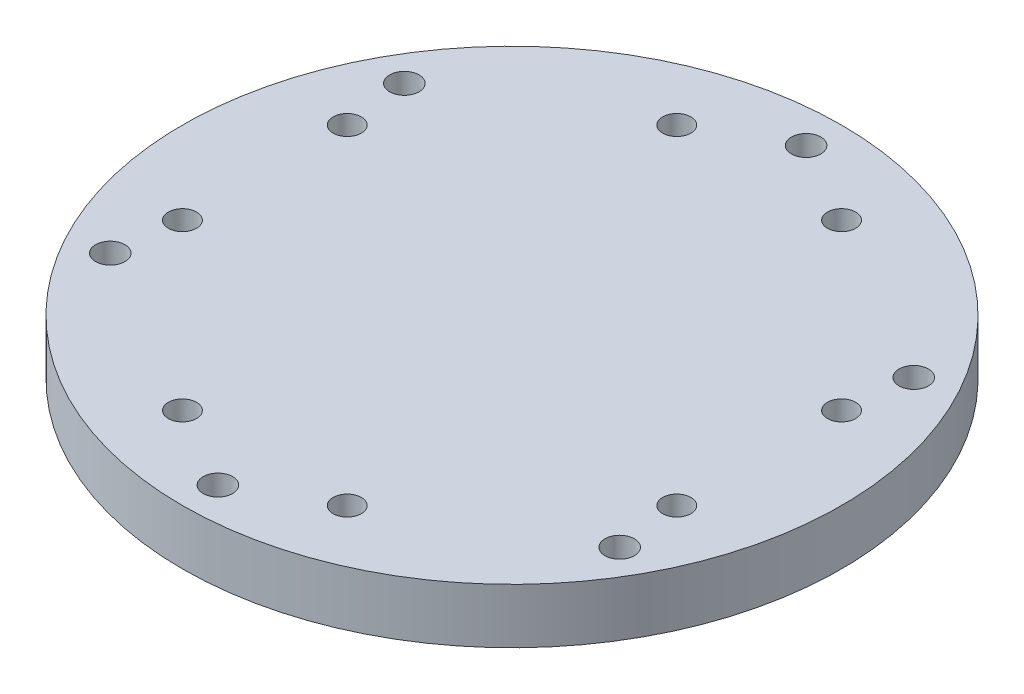
ISO-10303-21;
HEADER;
FILE_DESCRIPTION(('STEP AP214'),'2;1');
FILE_NAME('part.step','',(''),(''),'','','');
FILE_SCHEMA(('AUTOMOTIVE_DESIGN { 1 0 10303 214 1 1 1 1 }'));
ENDSEC;
DATA;
#1=APPLICATION_CONTEXT('core data for automotive mechanical design processes');
#2=APPLICATION_PROTOCOL_DEFINITION('international standard','automotive_design',2000,#1);
#3=PRODUCT_CONTEXT('',#1,'mechanical');
#4=PRODUCT('Part','Part','',(#3));
#5=PRODUCT_RELATED_PRODUCT_CATEGORY('part','',(#4));
#6=PRODUCT_DEFINITION_FORMATION('','',#4);
#7=PRODUCT_DEFINITION_CONTEXT('part definition',#1,'design');
#8=PRODUCT_DEFINITION('design','',#6,#7);
#9=PRODUCT_DEFINITION_SHAPE('','',#8);
#10=(LENGTH_UNIT() NAMED_UNIT(*) SI_UNIT(.MILLI.,.METRE.));
#11=(NAMED_UNIT(*) PLANE_ANGLE_UNIT() SI_UNIT($,.RADIAN.));
#12=(NAMED_UNIT(*) SI_UNIT($,.STERADIAN.) SOLID_ANGLE_UNIT());
#13=UNCERTAINTY_MEASURE_WITH_UNIT(LENGTH_MEASURE(1.E-05),#10,'distance_accuracy_value','');
#14=(GEOMETRIC_REPRESENTATION_CONTEXT(3) GLOBAL_UNCERTAINTY_ASSIGNED_CONTEXT((#13)) GLOBAL_UNIT_ASSIGNED_CONTEXT((#10,
#11,#12)) REPRESENTATION_CONTEXT('',''));
#15=CARTESIAN_POINT('',(0.,0.,0.));
#16=DIRECTION('',(0.,0.,1.));
#17=DIRECTION('',(1.,0.,0.));
#18=AXIS2_PLACEMENT_3D('',#15,#16,#17);
#19=CARTESIAN_POINT('',(0.,0.,0.));
#20=DIRECTION('',(0.,1.,0.));
#21=DIRECTION('',(0.,0.,1.));
#22=AXIS2_PLACEMENT_3D('',#19,#20,#21);
#23=PLANE('',#22);
#24=CARTESIAN_POINT('',(-57.1499999999973,0.,19.0499999994328));
#25=DIRECTION('',(0.,-1.,0.));
#26=DIRECTION('',(0.,0.,-1.));
#27=AXIS2_PLACEMENT_3D('',#24,#25,#26);
#28=CIRCLE('',#27,3.2639);
#29=CARTESIAN_POINT('',(-57.1499999999973,0.,15.7860999994328));
#30=VERTEX_POINT('',#29);
#31=EDGE_CURVE('E126',#30,#30,#28,.T.);
#32=ORIENTED_EDGE('',*,*,#31,.F.);
#33=EDGE_LOOP('',(#32));
#34=FACE_BOUND('',#33,.T.);
#35=CARTESIAN_POINT('',(19.0499999994334,0.,57.1499999999971));
#36=DIRECTION('',(0.,-1.,0.));
#37=DIRECTION('',(0.,0.,-1.));
#38=AXIS2_PLACEMENT_3D('',#35,#36,#37);
#39=CIRCLE('',#38,3.2639);
#40=CARTESIAN_POINT('',(19.0499999994334,0.,53.8860999999971));
#41=VERTEX_POINT('',#40);
#42=EDGE_CURVE('E114',#41,#41,#39,.T.);
#43=ORIENTED_EDGE('',*,*,#42,.F.);
#44=EDGE_LOOP('',(#43));
#45=FACE_BOUND('',#44,.T.);
#46=CARTESIAN_POINT('',(57.1499999999972,0.,-19.0499999994332));
#47=DIRECTION('',(0.,-1.,0.));
#48=DIRECTION('',(0.,0.,-1.));
#49=AXIS2_PLACEMENT_3D('',#46,#47,#48);
#50=CIRCLE('',#49,3.2639);
#51=CARTESIAN_POINT('',(57.1499999999972,0.,-22.3138999994332));
#52=VERTEX_POINT('',#51);
#53=EDGE_CURVE('E102',#52,#52,#50,.T.);
#54=ORIENTED_EDGE('',*,*,#53,.F.);
#55=EDGE_LOOP('',(#54));
#56=FACE_BOUND('',#55,.T.);
#57=CARTESIAN_POINT('',(19.0499999994334,0.,-57.1499999999971));
#58=DIRECTION('',(0.,-1.,0.));
#59=DIRECTION('',(0.,0.,-1.));
#60=AXIS2_PLACEMENT_3D('',#57,#58,#59);
#61=CIRCLE('',#60,3.2639);
#62=CARTESIAN_POINT('',(19.0499999994334,0.,-60.4138999999971));
#63=VERTEX_POINT('',#62);
#64=EDGE_CURVE('E96',#63,#63,#61,.T.);
#65=ORIENTED_EDGE('',*,*,#64,.F.);
#66=EDGE_LOOP('',(#65));
#67=FACE_BOUND('',#66,.T.);
#68=CARTESIAN_POINT('',(-19.0499999994334,0.,-57.1499999999971));
#69=DIRECTION('',(0.,-1.,0.));
#70=DIRECTION('',(0.,0.,-1.));
#71=AXIS2_PLACEMENT_3D('',#68,#69,#70);
#72=CIRCLE('',#71,3.2639);
#73=CARTESIAN_POINT('',(-19.0499999994334,0.,-60.4138999999971));
#74=VERTEX_POINT('',#73);
#75=EDGE_CURVE('E90',#74,#74,#72,.T.);
#76=ORIENTED_EDGE('',*,*,#75,.F.);
#77=EDGE_LOOP('',(#76));
#78=FACE_BOUND('',#77,.T.);
#79=CARTESIAN_POINT('',(-58.8897274573414,0.,-34.0000000000007));
#80=DIRECTION('',(0.,1.,0.));
#81=DIRECTION('',(0.866025403784433,0.,0.50000000000001));
#82=AXIS2_PLACEMENT_3D('',#79,#80,#81);
#83=CIRCLE('',#82,3.4);
#84=CARTESIAN_POINT('',(-55.9452410844744,0.,-32.3000000000007));
#85=VERTEX_POINT('',#84);
#86=EDGE_CURVE('E68',#85,#85,#83,.T.);
#87=ORIENTED_EDGE('',*,*,#86,.T.);
#88=EDGE_LOOP('',(#87));
#89=FACE_BOUND('',#88,.T.);
#90=CARTESIAN_POINT('',(-58.8897274573421,0.,33.9999999999995));
#91=DIRECTION('',(0.,1.,0.));
#92=DIRECTION('',(0.866025403784443,0.,-0.499999999999992));
#93=AXIS2_PLACEMENT_3D('',#90,#91,#92);
#94=CIRCLE('',#93,3.4);
#95=CARTESIAN_POINT('',(-55.945241084475,0.,32.2999999999995));
#96=VERTEX_POINT('',#95);
#97=EDGE_CURVE('E67',#96,#96,#94,.T.);
#98=ORIENTED_EDGE('',*,*,#97,.T.);
#99=EDGE_LOOP('',(#98));
#100=FACE_BOUND('',#99,.T.);
#101=CARTESIAN_POINT('',(0.,0.,68.));
#102=DIRECTION('',(0.,1.,0.));
#103=DIRECTION('',(0.,0.,-1.));
#104=AXIS2_PLACEMENT_3D('',#101,#102,#103);
#105=CIRCLE('',#104,3.4);
#106=CARTESIAN_POINT('',(0.,0.,64.6));
#107=VERTEX_POINT('',#106);
#108=EDGE_CURVE('E75',#107,#107,#105,.T.);
#109=ORIENTED_EDGE('',*,*,#108,.T.);
#110=EDGE_LOOP('',(#109));
#111=FACE_BOUND('',#110,.T.);
#112=CARTESIAN_POINT('',(58.8897274573417,0.,34.0000000000003));
#113=DIRECTION('',(0.,1.,0.));
#114=DIRECTION('',(-0.866025403784436,0.,-0.500000000000004));
#115=AXIS2_PLACEMENT_3D('',#112,#113,#114);
#116=CIRCLE('',#115,3.4);
#117=CARTESIAN_POINT('',(55.9452410844746,0.,32.3000000000003));
#118=VERTEX_POINT('',#117);
#119=EDGE_CURVE('E81',#118,#118,#116,.T.);
#120=ORIENTED_EDGE('',*,*,#119,.T.);
#121=EDGE_LOOP('',(#120));
#122=FACE_BOUND('',#121,.T.);
#123=CARTESIAN_POINT('',(58.8897274573419,0.,-33.9999999999999));
#124=DIRECTION('',(0.,1.,0.));
#125=DIRECTION('',(-0.86602540378444,0.,0.499999999999998));
#126=AXIS2_PLACEMENT_3D('',#123,#124,#125);
#127=CIRCLE('',#126,3.4);
#128=CARTESIAN_POINT('',(55.9452410844748,0.,-32.2999999999999));
#129=VERTEX_POINT('',#128);
#130=EDGE_CURVE('E60',#129,#129,#127,.T.);
#131=ORIENTED_EDGE('',*,*,#130,.T.);
#132=EDGE_LOOP('',(#131));
#133=FACE_BOUND('',#132,.T.);
#134=CARTESIAN_POINT('',(0.,0.,-68.));
#135=DIRECTION('',(0.,1.,0.));
#136=DIRECTION('',(0.,0.,1.));
#137=AXIS2_PLACEMENT_3D('',#134,#135,#136);
#138=CIRCLE('',#137,3.4);
#139=CARTESIAN_POINT('',(0.,0.,-64.6));
#140=VERTEX_POINT('',#139);
#141=EDGE_CURVE('E50',#140,#140,#138,.T.);
#142=ORIENTED_EDGE('',*,*,#141,.T.);
#143=EDGE_LOOP('',(#142));
#144=FACE_BOUND('',#143,.T.);
#145=CARTESIAN_POINT('',(0.,0.,0.));
#146=DIRECTION('',(0.,1.,0.));
#147=DIRECTION('',(0.,0.,1.));
#148=AXIS2_PLACEMENT_3D('',#145,#146,#147);
#149=CIRCLE('',#148,76.2);
#150=CARTESIAN_POINT('',(0.,0.,76.2));
#151=VERTEX_POINT('',#150);
#152=EDGE_CURVE('E43',#151,#151,#149,.T.);
#153=ORIENTED_EDGE('',*,*,#152,.F.);
#154=EDGE_LOOP('',(#153));
#155=FACE_BOUND('',#154,.T.);
#156=CARTESIAN_POINT('',(57.1499999999971,0.,19.0499999994336));
#157=DIRECTION('',(0.,-1.,0.));
#158=DIRECTION('',(0.,0.,-1.));
#159=AXIS2_PLACEMENT_3D('',#156,#157,#158);
#160=CIRCLE('',#159,3.2639);
#161=CARTESIAN_POINT('',(57.1499999999971,0.,15.7860999994336));
#162=VERTEX_POINT('',#161);
#163=EDGE_CURVE('E108',#162,#162,#160,.T.);
#164=ORIENTED_EDGE('',*,*,#163,.F.);
#165=EDGE_LOOP('',(#164));
#166=FACE_BOUND('',#165,.T.);
#167=CARTESIAN_POINT('',(-19.0499999994334,0.,57.1499999999971));
#168=DIRECTION('',(0.,-1.,0.));
#169=DIRECTION('',(0.,0.,-1.));
#170=AXIS2_PLACEMENT_3D('',#167,#168,#169);
#171=CIRCLE('',#170,3.2639);
#172=CARTESIAN_POINT('',(-19.0499999994334,0.,53.8860999999971));
#173=VERTEX_POINT('',#172);
#174=EDGE_CURVE('E120',#173,#173,#171,.T.);
#175=ORIENTED_EDGE('',*,*,#174,.F.);
#176=EDGE_LOOP('',(#175));
#177=FACE_BOUND('',#176,.T.);
#178=CARTESIAN_POINT('',(-57.1499999999969,0.,-19.049999999434));
#179=DIRECTION('',(0.,-1.,0.));
#180=DIRECTION('',(0.,0.,-1.));
#181=AXIS2_PLACEMENT_3D('',#178,#179,#180);
#182=CIRCLE('',#181,3.2639);
#183=CARTESIAN_POINT('',(-57.1499999999969,0.,-22.313899999434));
#184=VERTEX_POINT('',#183);
#185=EDGE_CURVE('E132',#184,#184,#182,.T.);
#186=ORIENTED_EDGE('',*,*,#185,.F.);
#187=EDGE_LOOP('',(#186));
#188=FACE_BOUND('',#187,.T.);
#189=ADVANCED_FACE('F39',(#34,#45,#56,#67,#78,#89,#100,#111,#122,#133,#144,#155,#166,#177,#188),
#23,.F.);
#190=CARTESIAN_POINT('',(0.,12.7,0.));
#191=DIRECTION('',(0.,1.,0.));
#192=DIRECTION('',(0.,0.,1.));
#193=AXIS2_PLACEMENT_3D('',#190,#191,#192);
#194=PLANE('',#193);
#195=CARTESIAN_POINT('',(-57.1499999999969,12.7,-19.049999999434));
#196=DIRECTION('',(0.,-1.,0.));
#197=DIRECTION('',(0.,0.,-1.));
#198=AXIS2_PLACEMENT_3D('',#195,#196,#197);
#199=CIRCLE('',#198,3.2639);
#200=CARTESIAN_POINT('',(-57.1499999999969,12.7,-22.313899999434));
#201=VERTEX_POINT('',#200);
#202=EDGE_CURVE('E129',#201,#201,#199,.T.);
#203=ORIENTED_EDGE('',*,*,#202,.T.);
#204=EDGE_LOOP('',(#203));
#205=FACE_BOUND('',#204,.T.);
#206=CARTESIAN_POINT('',(-19.0499999994334,12.7,57.1499999999971));
#207=DIRECTION('',(0.,-1.,0.));
#208=DIRECTION('',(0.,0.,-1.));
#209=AXIS2_PLACEMENT_3D('',#206,#207,#208);
#210=CIRCLE('',#209,3.2639);
#211=CARTESIAN_POINT('',(-19.0499999994334,12.7,53.8860999999971));
#212=VERTEX_POINT('',#211);
#213=EDGE_CURVE('E117',#212,#212,#210,.T.);
#214=ORIENTED_EDGE('',*,*,#213,.T.);
#215=EDGE_LOOP('',(#214));
#216=FACE_BOUND('',#215,.T.);
#217=CARTESIAN_POINT('',(19.0499999994334,12.7,57.1499999999971));
#218=DIRECTION('',(0.,-1.,0.));
#219=DIRECTION('',(0.,0.,-1.));
#220=AXIS2_PLACEMENT_3D('',#217,#218,#219);
#221=CIRCLE('',#220,3.2639);
#222=CARTESIAN_POINT('',(19.0499999994334,12.7,53.8860999999971));
#223=VERTEX_POINT('',#222);
#224=EDGE_CURVE('E111',#223,#223,#221,.T.);
#225=ORIENTED_EDGE('',*,*,#224,.T.);
#226=EDGE_LOOP('',(#225));
#227=FACE_BOUND('',#226,.T.);
#228=CARTESIAN_POINT('',(57.1499999999971,12.7,19.0499999994336));
#229=DIRECTION('',(0.,-1.,0.));
#230=DIRECTION('',(0.,0.,-1.));
#231=AXIS2_PLACEMENT_3D('',#228,#229,#230);
#232=CIRCLE('',#231,3.2639);
#233=CARTESIAN_POINT('',(57.1499999999971,12.7,15.7860999994336));
#234=VERTEX_POINT('',#233);
#235=EDGE_CURVE('E105',#234,#234,#232,.T.);
#236=ORIENTED_EDGE('',*,*,#235,.T.);
#237=EDGE_LOOP('',(#236));
#238=FACE_BOUND('',#237,.T.);
#239=CARTESIAN_POINT('',(0.,12.7,0.));
#240=DIRECTION('',(0.,1.,0.));
#241=DIRECTION('',(0.,0.,1.));
#242=AXIS2_PLACEMENT_3D('',#239,#240,#241);
#243=CIRCLE('',#242,76.2);
#244=CARTESIAN_POINT('',(0.,12.7,76.2));
#245=VERTEX_POINT('',#244);
#246=EDGE_CURVE('E10',#245,#245,#243,.T.);
#247=ORIENTED_EDGE('',*,*,#246,.T.);
#248=EDGE_LOOP('',(#247));
#249=FACE_BOUND('',#248,.T.);
#250=CARTESIAN_POINT('',(0.,12.7,-68.));
#251=DIRECTION('',(0.,1.,0.));
#252=DIRECTION('',(0.,0.,1.));
#253=AXIS2_PLACEMENT_3D('',#250,#251,#252);
#254=CIRCLE('',#253,3.4);
#255=CARTESIAN_POINT('',(0.,12.7,-64.6));
#256=VERTEX_POINT('',#255);
#257=EDGE_CURVE('E54',#256,#256,#254,.T.);
#258=ORIENTED_EDGE('',*,*,#257,.F.);
#259=EDGE_LOOP('',(#258));
#260=FACE_BOUND('',#259,.T.);
#261=CARTESIAN_POINT('',(58.8897274573419,12.7,-33.9999999999999));
#262=DIRECTION('',(0.,1.,0.));
#263=DIRECTION('',(-0.86602540378444,0.,0.499999999999998));
#264=AXIS2_PLACEMENT_3D('',#261,#262,#263);
#265=CIRCLE('',#264,3.4);
#266=CARTESIAN_POINT('',(55.9452410844748,12.7,-32.2999999999999));
#267=VERTEX_POINT('',#266);
#268=EDGE_CURVE('E57',#267,#267,#265,.T.);
#269=ORIENTED_EDGE('',*,*,#268,.F.);
#270=EDGE_LOOP('',(#269));
#271=FACE_BOUND('',#270,.T.);
#272=CARTESIAN_POINT('',(58.8897274573417,12.7,34.0000000000003));
#273=DIRECTION('',(0.,1.,0.));
#274=DIRECTION('',(-0.866025403784436,0.,-0.500000000000004));
#275=AXIS2_PLACEMENT_3D('',#272,#273,#274);
#276=CIRCLE('',#275,3.4);
#277=CARTESIAN_POINT('',(55.9452410844746,12.7,32.3000000000003));
#278=VERTEX_POINT('',#277);
#279=EDGE_CURVE('E63',#278,#278,#276,.T.);
#280=ORIENTED_EDGE('',*,*,#279,.F.);
#281=EDGE_LOOP('',(#280));
#282=FACE_BOUND('',#281,.T.);
#283=CARTESIAN_POINT('',(0.,12.7,68.));
#284=DIRECTION('',(0.,1.,0.));
#285=DIRECTION('',(0.,0.,-1.));
#286=AXIS2_PLACEMENT_3D('',#283,#284,#285);
#287=CIRCLE('',#286,3.4);
#288=CARTESIAN_POINT('',(0.,12.7,64.6));
#289=VERTEX_POINT('',#288);
#290=EDGE_CURVE('E78',#289,#289,#287,.T.);
#291=ORIENTED_EDGE('',*,*,#290,.F.);
#292=EDGE_LOOP('',(#291));
#293=FACE_BOUND('',#292,.T.);
#294=CARTESIAN_POINT('',(-58.8897274573421,12.7,33.9999999999995));
#295=DIRECTION('',(0.,1.,0.));
#296=DIRECTION('',(0.866025403784443,0.,-0.499999999999992));
#297=AXIS2_PLACEMENT_3D('',#294,#295,#296);
#298=CIRCLE('',#297,3.4);
#299=CARTESIAN_POINT('',(-55.945241084475,12.7,32.2999999999995));
#300=VERTEX_POINT('',#299);
#301=EDGE_CURVE('E72',#300,#300,#298,.T.);
#302=ORIENTED_EDGE('',*,*,#301,.F.);
#303=EDGE_LOOP('',(#302));
#304=FACE_BOUND('',#303,.T.);
#305=CARTESIAN_POINT('',(-58.8897274573414,12.7,-34.0000000000007));
#306=DIRECTION('',(0.,1.,0.));
#307=DIRECTION('',(0.866025403784433,0.,0.50000000000001));
#308=AXIS2_PLACEMENT_3D('',#305,#306,#307);
#309=CIRCLE('',#308,3.4);
#310=CARTESIAN_POINT('',(-55.9452410844744,12.7,-32.3000000000007));
#311=VERTEX_POINT('',#310);
#312=EDGE_CURVE('E64',#311,#311,#309,.T.);
#313=ORIENTED_EDGE('',*,*,#312,.F.);
#314=EDGE_LOOP('',(#313));
#315=FACE_BOUND('',#314,.T.);
#316=CARTESIAN_POINT('',(-19.0499999994334,12.7,-57.1499999999971));
#317=DIRECTION('',(0.,-1.,0.));
#318=DIRECTION('',(0.,0.,-1.));
#319=AXIS2_PLACEMENT_3D('',#316,#317,#318);
#320=CIRCLE('',#319,3.2639);
#321=CARTESIAN_POINT('',(-19.0499999994334,12.7,-60.4138999999971));
#322=VERTEX_POINT('',#321);
#323=EDGE_CURVE('E71',#322,#322,#320,.T.);
#324=ORIENTED_EDGE('',*,*,#323,.T.);
#325=EDGE_LOOP('',(#324));
#326=FACE_BOUND('',#325,.T.);
#327=CARTESIAN_POINT('',(19.0499999994334,12.7,-57.1499999999971));
#328=DIRECTION('',(0.,-1.,0.));
#329=DIRECTION('',(0.,0.,-1.));
#330=AXIS2_PLACEMENT_3D('',#327,#328,#329);
#331=CIRCLE('',#330,3.2639);
#332=CARTESIAN_POINT('',(19.0499999994334,12.7,-60.4138999999971));
#333=VERTEX_POINT('',#332);
#334=EDGE_CURVE('E93',#333,#333,#331,.T.);
#335=ORIENTED_EDGE('',*,*,#334,.T.);
#336=EDGE_LOOP('',(#335));
#337=FACE_BOUND('',#336,.T.);
#338=CARTESIAN_POINT('',(57.1499999999972,12.7,-19.0499999994332));
#339=DIRECTION('',(0.,-1.,0.));
#340=DIRECTION('',(0.,0.,-1.));
#341=AXIS2_PLACEMENT_3D('',#338,#339,#340);
#342=CIRCLE('',#341,3.2639);
#343=CARTESIAN_POINT('',(57.1499999999972,12.7,-22.3138999994332));
#344=VERTEX_POINT('',#343);
#345=EDGE_CURVE('E99',#344,#344,#342,.T.);
#346=ORIENTED_EDGE('',*,*,#345,.T.);
#347=EDGE_LOOP('',(#346));
#348=FACE_BOUND('',#347,.T.);
#349=CARTESIAN_POINT('',(-57.1499999999973,12.7,19.0499999994328));
#350=DIRECTION('',(0.,-1.,0.));
#351=DIRECTION('',(0.,0.,-1.));
#352=AXIS2_PLACEMENT_3D('',#349,#350,#351);
#353=CIRCLE('',#352,3.2639);
#354=CARTESIAN_POINT('',(-57.1499999999973,12.7,15.7860999994328));
#355=VERTEX_POINT('',#354);
#356=EDGE_CURVE('E123',#355,#355,#353,.T.);
#357=ORIENTED_EDGE('',*,*,#356,.T.);
#358=EDGE_LOOP('',(#357));
#359=FACE_BOUND('',#358,.T.);
#360=ADVANCED_FACE('F139',(#205,#216,#227,#238,#249,#260,#271,#282,#293,#304,#315,#326,#337,
#348,#359),#194,.T.);
#361=CARTESIAN_POINT('',(0.,12.7,0.));
#362=DIRECTION('',(0.,-1.,0.));
#363=DIRECTION('',(0.,0.,-1.));
#364=AXIS2_PLACEMENT_3D('',#361,#362,#363);
#365=CYLINDRICAL_SURFACE('',#364,76.2);
#366=ORIENTED_EDGE('',*,*,#246,.F.);
#367=EDGE_LOOP('',(#366));
#368=FACE_BOUND('',#367,.T.);
#369=ORIENTED_EDGE('',*,*,#152,.T.);
#370=EDGE_LOOP('',(#369));
#371=FACE_BOUND('',#370,.T.);
#372=ADVANCED_FACE('F41',(#368,#371),#365,.T.);
#373=CARTESIAN_POINT('',(0.,12.7,-68.));
#374=DIRECTION('',(0.,1.,0.));
#375=DIRECTION('',(0.,0.,1.));
#376=AXIS2_PLACEMENT_3D('',#373,#374,#375);
#377=CYLINDRICAL_SURFACE('',#376,3.4);
#378=ORIENTED_EDGE('',*,*,#141,.F.);
#379=EDGE_LOOP('',(#378));
#380=FACE_BOUND('',#379,.T.);
#381=ORIENTED_EDGE('',*,*,#257,.T.);
#382=EDGE_LOOP('',(#381));
#383=FACE_BOUND('',#382,.T.);
#384=ADVANCED_FACE('F149',(#380,#383),#377,.F.);
#385=CARTESIAN_POINT('',(58.8897274573419,12.7,-33.9999999999999));
#386=DIRECTION('',(0.,1.,0.));
#387=DIRECTION('',(-0.86602540378444,0.,0.499999999999998));
#388=AXIS2_PLACEMENT_3D('',#385,#386,#387);
#389=CYLINDRICAL_SURFACE('',#388,3.4);
#390=ORIENTED_EDGE('',*,*,#130,.F.);
#391=EDGE_LOOP('',(#390));
#392=FACE_BOUND('',#391,.T.);
#393=ORIENTED_EDGE('',*,*,#268,.T.);
#394=EDGE_LOOP('',(#393));
#395=FACE_BOUND('',#394,.T.);
#396=ADVANCED_FACE('F152',(#392,#395),#389,.F.);
#397=CARTESIAN_POINT('',(58.8897274573417,12.7,34.0000000000003));
#398=DIRECTION('',(0.,1.,0.));
#399=DIRECTION('',(-0.866025403784436,0.,-0.500000000000004));
#400=AXIS2_PLACEMENT_3D('',#397,#398,#399);
#401=CYLINDRICAL_SURFACE('',#400,3.4);
#402=ORIENTED_EDGE('',*,*,#119,.F.);
#403=EDGE_LOOP('',(#402));
#404=FACE_BOUND('',#403,.T.);
#405=ORIENTED_EDGE('',*,*,#279,.T.);
#406=EDGE_LOOP('',(#405));
#407=FACE_BOUND('',#406,.T.);
#408=ADVANCED_FACE('F156',(#404,#407),#401,.F.);
#409=CARTESIAN_POINT('',(0.,12.7,68.));
#410=DIRECTION('',(0.,1.,0.));
#411=DIRECTION('',(0.,0.,-1.));
#412=AXIS2_PLACEMENT_3D('',#409,#410,#411);
#413=CYLINDRICAL_SURFACE('',#412,3.4);
#414=ORIENTED_EDGE('',*,*,#108,.F.);
#415=EDGE_LOOP('',(#414));
#416=FACE_BOUND('',#415,.T.);
#417=ORIENTED_EDGE('',*,*,#290,.T.);
#418=EDGE_LOOP('',(#417));
#419=FACE_BOUND('',#418,.T.);
#420=ADVANCED_FACE('F166',(#416,#419),#413,.F.);
#421=CARTESIAN_POINT('',(-58.8897274573421,12.7,33.9999999999995));
#422=DIRECTION('',(0.,1.,0.));
#423=DIRECTION('',(0.866025403784443,0.,-0.499999999999992));
#424=AXIS2_PLACEMENT_3D('',#421,#422,#423);
#425=CYLINDRICAL_SURFACE('',#424,3.4);
#426=ORIENTED_EDGE('',*,*,#97,.F.);
#427=EDGE_LOOP('',(#426));
#428=FACE_BOUND('',#427,.T.);
#429=ORIENTED_EDGE('',*,*,#301,.T.);
#430=EDGE_LOOP('',(#429));
#431=FACE_BOUND('',#430,.T.);
#432=ADVANCED_FACE('F162',(#428,#431),#425,.F.);
#433=CARTESIAN_POINT('',(-58.8897274573414,12.7,-34.0000000000007));
#434=DIRECTION('',(0.,1.,0.));
#435=DIRECTION('',(0.866025403784433,0.,0.50000000000001));
#436=AXIS2_PLACEMENT_3D('',#433,#434,#435);
#437=CYLINDRICAL_SURFACE('',#436,3.4);
#438=ORIENTED_EDGE('',*,*,#86,.F.);
#439=EDGE_LOOP('',(#438));
#440=FACE_BOUND('',#439,.T.);
#441=ORIENTED_EDGE('',*,*,#312,.T.);
#442=EDGE_LOOP('',(#441));
#443=FACE_BOUND('',#442,.T.);
#444=ADVANCED_FACE('F158',(#440,#443),#437,.F.);
#445=CARTESIAN_POINT('',(-19.0499999994334,0.,-57.1499999999971));
#446=DIRECTION('',(0.,-1.,0.));
#447=DIRECTION('',(0.,0.,-1.));
#448=AXIS2_PLACEMENT_3D('',#445,#446,#447);
#449=CYLINDRICAL_SURFACE('',#448,3.2639);
#450=ORIENTED_EDGE('',*,*,#323,.F.);
#451=EDGE_LOOP('',(#450));
#452=FACE_BOUND('',#451,.T.);
#453=ORIENTED_EDGE('',*,*,#75,.T.);
#454=EDGE_LOOP('',(#453));
#455=FACE_BOUND('',#454,.T.);
#456=ADVANCED_FACE('F161',(#452,#455),#449,.F.);
#457=CARTESIAN_POINT('',(19.0499999994334,0.,-57.1499999999971));
#458=DIRECTION('',(0.,-1.,0.));
#459=DIRECTION('',(0.,0.,-1.));
#460=AXIS2_PLACEMENT_3D('',#457,#458,#459);
#461=CYLINDRICAL_SURFACE('',#460,3.2639);
#462=ORIENTED_EDGE('',*,*,#334,.F.);
#463=EDGE_LOOP('',(#462));
#464=FACE_BOUND('',#463,.T.);
#465=ORIENTED_EDGE('',*,*,#64,.T.);
#466=EDGE_LOOP('',(#465));
#467=FACE_BOUND('',#466,.T.);
#468=ADVANCED_FACE('F176',(#464,#467),#461,.F.);
#469=CARTESIAN_POINT('',(57.1499999999972,0.,-19.0499999994332));
#470=DIRECTION('',(0.,-1.,0.));
#471=DIRECTION('',(0.,0.,-1.));
#472=AXIS2_PLACEMENT_3D('',#469,#470,#471);
#473=CYLINDRICAL_SURFACE('',#472,3.2639);
#474=ORIENTED_EDGE('',*,*,#345,.F.);
#475=EDGE_LOOP('',(#474));
#476=FACE_BOUND('',#475,.T.);
#477=ORIENTED_EDGE('',*,*,#53,.T.);
#478=EDGE_LOOP('',(#477));
#479=FACE_BOUND('',#478,.T.);
#480=ADVANCED_FACE('F180',(#476,#479),#473,.F.);
#481=CARTESIAN_POINT('',(57.1499999999971,0.,19.0499999994336));
#482=DIRECTION('',(0.,-1.,0.));
#483=DIRECTION('',(0.,0.,-1.));
#484=AXIS2_PLACEMENT_3D('',#481,#482,#483);
#485=CYLINDRICAL_SURFACE('',#484,3.2639);
#486=ORIENTED_EDGE('',*,*,#235,.F.);
#487=EDGE_LOOP('',(#486));
#488=FACE_BOUND('',#487,.T.);
#489=ORIENTED_EDGE('',*,*,#163,.T.);
#490=EDGE_LOOP('',(#489));
#491=FACE_BOUND('',#490,.T.);
#492=ADVANCED_FACE('F184',(#488,#491),#485,.F.);
#493=CARTESIAN_POINT('',(19.0499999994334,0.,57.1499999999971));
#494=DIRECTION('',(0.,-1.,0.));
#495=DIRECTION('',(0.,0.,-1.));
#496=AXIS2_PLACEMENT_3D('',#493,#494,#495);
#497=CYLINDRICAL_SURFACE('',#496,3.2639);
#498=ORIENTED_EDGE('',*,*,#224,.F.);
#499=EDGE_LOOP('',(#498));
#500=FACE_BOUND('',#499,.T.);
#501=ORIENTED_EDGE('',*,*,#42,.T.);
#502=EDGE_LOOP('',(#501));
#503=FACE_BOUND('',#502,.T.);
#504=ADVANCED_FACE('F188',(#500,#503),#497,.F.);
#505=CARTESIAN_POINT('',(-19.0499999994334,0.,57.1499999999971));
#506=DIRECTION('',(0.,-1.,0.));
#507=DIRECTION('',(0.,0.,-1.));
#508=AXIS2_PLACEMENT_3D('',#505,#506,#507);
#509=CYLINDRICAL_SURFACE('',#508,3.2639);
#510=ORIENTED_EDGE('',*,*,#213,.F.);
#511=EDGE_LOOP('',(#510));
#512=FACE_BOUND('',#511,.T.);
#513=ORIENTED_EDGE('',*,*,#174,.T.);
#514=EDGE_LOOP('',(#513));
#515=FACE_BOUND('',#514,.T.);
#516=ADVANCED_FACE('F192',(#512,#515),#509,.F.);
#517=CARTESIAN_POINT('',(-57.1499999999973,0.,19.0499999994328));
#518=DIRECTION('',(0.,-1.,0.));
#519=DIRECTION('',(0.,0.,-1.));
#520=AXIS2_PLACEMENT_3D('',#517,#518,#519);
#521=CYLINDRICAL_SURFACE('',#520,3.2639);
#522=ORIENTED_EDGE('',*,*,#356,.F.);
#523=EDGE_LOOP('',(#522));
#524=FACE_BOUND('',#523,.T.);
#525=ORIENTED_EDGE('',*,*,#31,.T.);
#526=EDGE_LOOP('',(#525));
#527=FACE_BOUND('',#526,.T.);
#528=ADVANCED_FACE('F196',(#524,#527),#521,.F.);
#529=CARTESIAN_POINT('',(-57.1499999999969,0.,-19.049999999434));
#530=DIRECTION('',(0.,-1.,0.));
#531=DIRECTION('',(0.,0.,-1.));
#532=AXIS2_PLACEMENT_3D('',#529,#530,#531);
#533=CYLINDRICAL_SURFACE('',#532,3.2639);
#534=ORIENTED_EDGE('',*,*,#202,.F.);
#535=EDGE_LOOP('',(#534));
#536=FACE_BOUND('',#535,.T.);
#537=ORIENTED_EDGE('',*,*,#185,.T.);
#538=EDGE_LOOP('',(#537));
#539=FACE_BOUND('',#538,.T.);
#540=ADVANCED_FACE('F136',(#536,#539),#533,.F.);
#541=CLOSED_SHELL('',(#189,#360,#372,#384,#396,#408,#420,#432,#444,#456,#468,#480,#492,#504,
#516,#528,#540));
#542=MANIFOLD_SOLID_BREP('B2',#541);
#543=ADVANCED_BREP_SHAPE_REPRESENTATION('',(#18,#542),#14);
#544=SHAPE_DEFINITION_REPRESENTATION(#9,#543);
ENDSEC;
END-ISO-10303-21;
